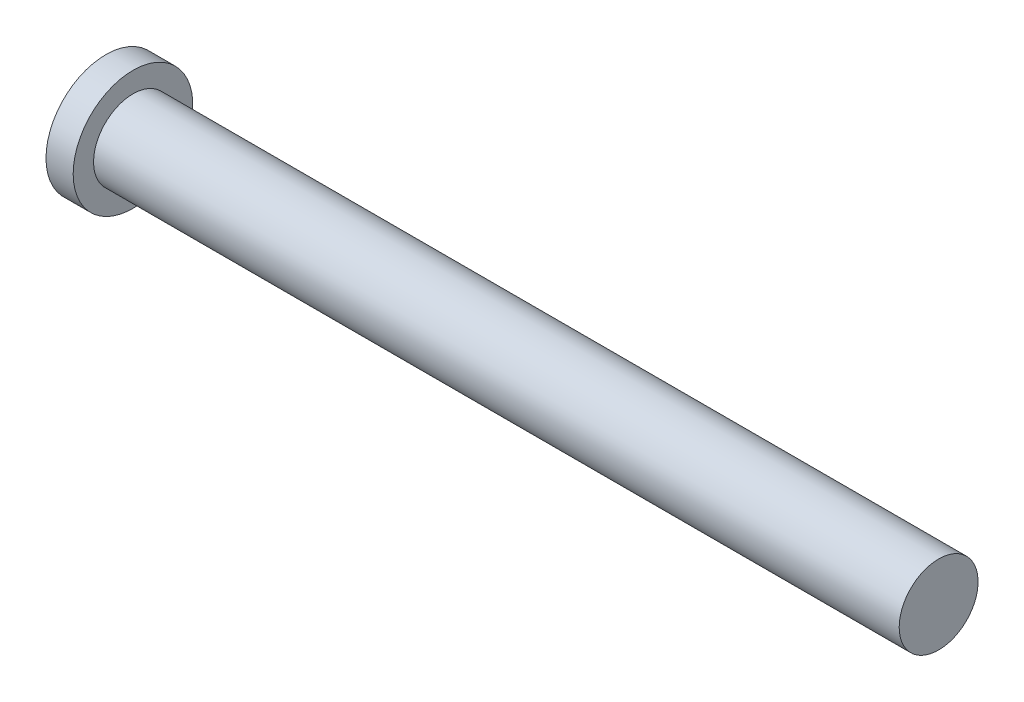
ISO-10303-21;
HEADER;
FILE_DESCRIPTION(('STEP AP214'),'2;1');
FILE_NAME('part.step','',(''),(''),'','','');
FILE_SCHEMA(('AUTOMOTIVE_DESIGN { 1 0 10303 214 1 1 1 1 }'));
ENDSEC;
DATA;
#1=APPLICATION_CONTEXT('core data for automotive mechanical design processes');
#2=APPLICATION_PROTOCOL_DEFINITION('international standard','automotive_design',2000,#1);
#3=PRODUCT_CONTEXT('',#1,'mechanical');
#4=PRODUCT('Part','Part','',(#3));
#5=PRODUCT_RELATED_PRODUCT_CATEGORY('part','',(#4));
#6=PRODUCT_DEFINITION_FORMATION('','',#4);
#7=PRODUCT_DEFINITION_CONTEXT('part definition',#1,'design');
#8=PRODUCT_DEFINITION('design','',#6,#7);
#9=PRODUCT_DEFINITION_SHAPE('','',#8);
#10=(LENGTH_UNIT() NAMED_UNIT(*) SI_UNIT(.MILLI.,.METRE.));
#11=(NAMED_UNIT(*) PLANE_ANGLE_UNIT() SI_UNIT($,.RADIAN.));
#12=(NAMED_UNIT(*) SI_UNIT($,.STERADIAN.) SOLID_ANGLE_UNIT());
#13=UNCERTAINTY_MEASURE_WITH_UNIT(LENGTH_MEASURE(1.E-05),#10,'distance_accuracy_value','');
#14=(GEOMETRIC_REPRESENTATION_CONTEXT(3) GLOBAL_UNCERTAINTY_ASSIGNED_CONTEXT((#13)) GLOBAL_UNIT_ASSIGNED_CONTEXT((#10,
#11,#12)) REPRESENTATION_CONTEXT('',''));
#15=CARTESIAN_POINT('',(0.,0.,0.));
#16=DIRECTION('',(0.,0.,1.));
#17=DIRECTION('',(1.,0.,0.));
#18=AXIS2_PLACEMENT_3D('',#15,#16,#17);
#19=CARTESIAN_POINT('',(0.,0.,0.));
#20=DIRECTION('',(-1.,0.,0.));
#21=DIRECTION('',(0.,0.,1.));
#22=AXIS2_PLACEMENT_3D('',#19,#20,#21);
#23=CYLINDRICAL_SURFACE('',#22,2.25);
#24=CARTESIAN_POINT('',(83.5,0.,0.));
#25=DIRECTION('',(-1.,0.,0.));
#26=DIRECTION('',(0.,0.,1.));
#27=AXIS2_PLACEMENT_3D('',#24,#25,#26);
#28=CIRCLE('',#27,2.25);
#29=CARTESIAN_POINT('',(83.5,0.,2.25));
#30=VERTEX_POINT('',#29);
#31=EDGE_CURVE('E54',#30,#30,#28,.T.);
#32=ORIENTED_EDGE('',*,*,#31,.F.);
#33=EDGE_LOOP('',(#32));
#34=FACE_BOUND('',#33,.T.);
#35=CARTESIAN_POINT('',(0.,0.,0.));
#36=DIRECTION('',(-1.,0.,0.));
#37=DIRECTION('',(0.,0.,1.));
#38=AXIS2_PLACEMENT_3D('',#35,#36,#37);
#39=CIRCLE('',#38,2.25);
#40=CARTESIAN_POINT('',(0.,0.,2.25));
#41=VERTEX_POINT('',#40);
#42=EDGE_CURVE('E10',#41,#41,#39,.T.);
#43=ORIENTED_EDGE('',*,*,#42,.T.);
#44=EDGE_LOOP('',(#43));
#45=FACE_BOUND('',#44,.T.);
#46=ADVANCED_FACE('F32',(#34,#45),#23,.F.);
#47=CARTESIAN_POINT('',(0.,2.25,0.));
#48=DIRECTION('',(1.,0.,0.));
#49=DIRECTION('',(0.,0.,-1.));
#50=AXIS2_PLACEMENT_3D('',#47,#48,#49);
#51=PLANE('',#50);
#52=ORIENTED_EDGE('',*,*,#42,.F.);
#53=EDGE_LOOP('',(#52));
#54=FACE_BOUND('',#53,.T.);
#55=CARTESIAN_POINT('',(0.,0.,0.));
#56=DIRECTION('',(-1.,0.,0.));
#57=DIRECTION('',(0.,0.,1.));
#58=AXIS2_PLACEMENT_3D('',#55,#56,#57);
#59=CIRCLE('',#58,6.825);
#60=CARTESIAN_POINT('',(0.,0.,6.825));
#61=VERTEX_POINT('',#60);
#62=EDGE_CURVE('E38',#61,#61,#59,.T.);
#63=ORIENTED_EDGE('',*,*,#62,.T.);
#64=EDGE_LOOP('',(#63));
#65=FACE_BOUND('',#64,.T.);
#66=ADVANCED_FACE('F61',(#54,#65),#51,.F.);
#67=CARTESIAN_POINT('',(0.,0.,0.));
#68=DIRECTION('',(-1.,0.,0.));
#69=DIRECTION('',(0.,0.,1.));
#70=AXIS2_PLACEMENT_3D('',#67,#68,#69);
#71=CYLINDRICAL_SURFACE('',#70,6.825);
#72=ORIENTED_EDGE('',*,*,#62,.F.);
#73=EDGE_LOOP('',(#72));
#74=FACE_BOUND('',#73,.T.);
#75=CARTESIAN_POINT('',(3.1,0.,0.));
#76=DIRECTION('',(-1.,0.,0.));
#77=DIRECTION('',(0.,0.,1.));
#78=AXIS2_PLACEMENT_3D('',#75,#76,#77);
#79=CIRCLE('',#78,6.825);
#80=CARTESIAN_POINT('',(3.1,0.,6.825));
#81=VERTEX_POINT('',#80);
#82=EDGE_CURVE('E42',#81,#81,#79,.T.);
#83=ORIENTED_EDGE('',*,*,#82,.T.);
#84=EDGE_LOOP('',(#83));
#85=FACE_BOUND('',#84,.T.);
#86=ADVANCED_FACE('F65',(#74,#85),#71,.T.);
#87=CARTESIAN_POINT('',(3.1,6.825,0.));
#88=DIRECTION('',(-1.,0.,0.));
#89=DIRECTION('',(0.,0.,1.));
#90=AXIS2_PLACEMENT_3D('',#87,#88,#89);
#91=PLANE('',#90);
#92=ORIENTED_EDGE('',*,*,#82,.F.);
#93=EDGE_LOOP('',(#92));
#94=FACE_BOUND('',#93,.T.);
#95=CARTESIAN_POINT('',(3.1,0.,0.));
#96=DIRECTION('',(-1.,0.,0.));
#97=DIRECTION('',(0.,0.,1.));
#98=AXIS2_PLACEMENT_3D('',#95,#96,#97);
#99=CIRCLE('',#98,4.5);
#100=CARTESIAN_POINT('',(3.1,0.,4.5));
#101=VERTEX_POINT('',#100);
#102=EDGE_CURVE('E46',#101,#101,#99,.T.);
#103=ORIENTED_EDGE('',*,*,#102,.T.);
#104=EDGE_LOOP('',(#103));
#105=FACE_BOUND('',#104,.T.);
#106=ADVANCED_FACE('F70',(#94,#105),#91,.F.);
#107=CARTESIAN_POINT('',(0.,0.,0.));
#108=DIRECTION('',(-1.,0.,0.));
#109=DIRECTION('',(0.,0.,1.));
#110=AXIS2_PLACEMENT_3D('',#107,#108,#109);
#111=CYLINDRICAL_SURFACE('',#110,4.5);
#112=ORIENTED_EDGE('',*,*,#102,.F.);
#113=EDGE_LOOP('',(#112));
#114=FACE_BOUND('',#113,.T.);
#115=CARTESIAN_POINT('',(95.,0.,0.));
#116=DIRECTION('',(-1.,0.,0.));
#117=DIRECTION('',(0.,0.,1.));
#118=AXIS2_PLACEMENT_3D('',#115,#116,#117);
#119=CIRCLE('',#118,4.5);
#120=CARTESIAN_POINT('',(95.,0.,4.5));
#121=VERTEX_POINT('',#120);
#122=EDGE_CURVE('E51',#121,#121,#119,.T.);
#123=ORIENTED_EDGE('',*,*,#122,.T.);
#124=EDGE_LOOP('',(#123));
#125=FACE_BOUND('',#124,.T.);
#126=ADVANCED_FACE('F76',(#114,#125),#111,.T.);
#127=CARTESIAN_POINT('',(95.,4.5,0.));
#128=DIRECTION('',(-1.,0.,0.));
#129=DIRECTION('',(0.,0.,1.));
#130=AXIS2_PLACEMENT_3D('',#127,#128,#129);
#131=PLANE('',#130);
#132=ORIENTED_EDGE('',*,*,#122,.F.);
#133=EDGE_LOOP('',(#132));
#134=FACE_BOUND('',#133,.T.);
#135=ADVANCED_FACE('F80',(#134),#131,.F.);
#136=CARTESIAN_POINT('',(83.5,2.25,0.));
#137=DIRECTION('',(1.,0.,0.));
#138=DIRECTION('',(0.,0.,-1.));
#139=AXIS2_PLACEMENT_3D('',#136,#137,#138);
#140=PLANE('',#139);
#141=ORIENTED_EDGE('',*,*,#31,.T.);
#142=EDGE_LOOP('',(#141));
#143=FACE_BOUND('',#142,.T.);
#144=ADVANCED_FACE('F58',(#143),#140,.F.);
#145=CLOSED_SHELL('',(#46,#66,#86,#106,#126,#135,#144));
#146=MANIFOLD_SOLID_BREP('B2',#145);
#147=ADVANCED_BREP_SHAPE_REPRESENTATION('',(#18,#146),#14);
#148=SHAPE_DEFINITION_REPRESENTATION(#9,#147);
ENDSEC;
END-ISO-10303-21;
